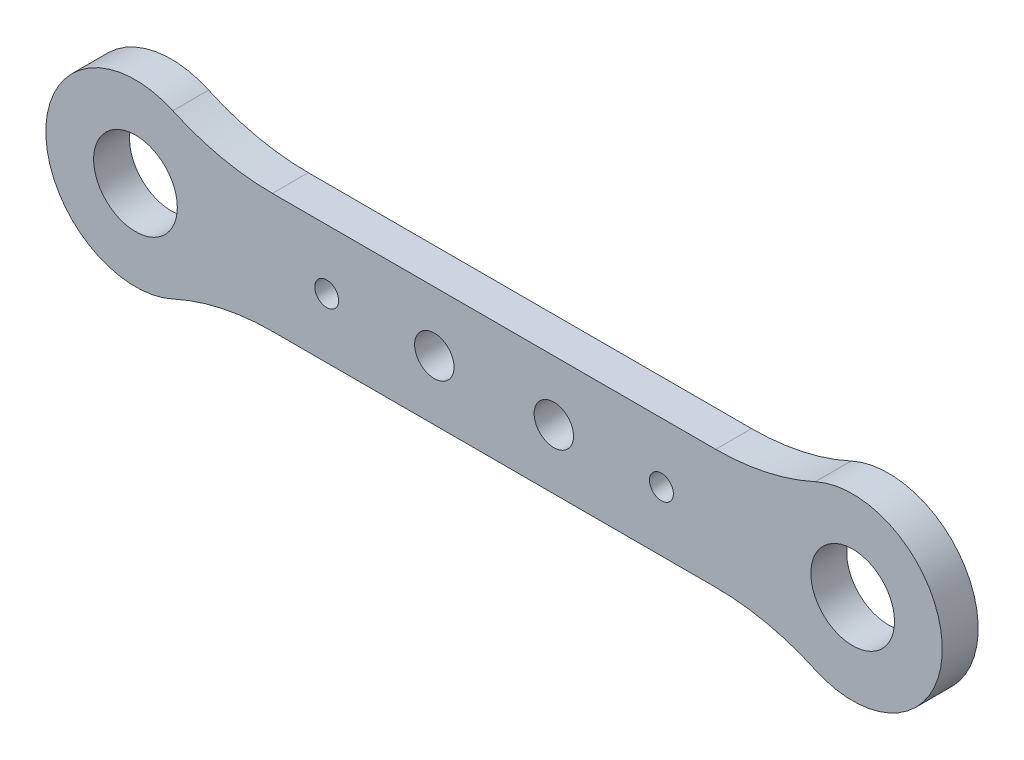
ISO-10303-21;
HEADER;
FILE_DESCRIPTION(('STEP AP214'),'2;1');
FILE_NAME('part.step','',(''),(''),'','','');
FILE_SCHEMA(('AUTOMOTIVE_DESIGN { 1 0 10303 214 1 1 1 1 }'));
ENDSEC;
DATA;
#1=APPLICATION_CONTEXT('core data for automotive mechanical design processes');
#2=APPLICATION_PROTOCOL_DEFINITION('international standard','automotive_design',2000,#1);
#3=PRODUCT_CONTEXT('',#1,'mechanical');
#4=PRODUCT('Part','Part','',(#3));
#5=PRODUCT_RELATED_PRODUCT_CATEGORY('part','',(#4));
#6=PRODUCT_DEFINITION_FORMATION('','',#4);
#7=PRODUCT_DEFINITION_CONTEXT('part definition',#1,'design');
#8=PRODUCT_DEFINITION('design','',#6,#7);
#9=PRODUCT_DEFINITION_SHAPE('','',#8);
#10=(LENGTH_UNIT() NAMED_UNIT(*) SI_UNIT(.MILLI.,.METRE.));
#11=(NAMED_UNIT(*) PLANE_ANGLE_UNIT() SI_UNIT($,.RADIAN.));
#12=(NAMED_UNIT(*) SI_UNIT($,.STERADIAN.) SOLID_ANGLE_UNIT());
#13=UNCERTAINTY_MEASURE_WITH_UNIT(LENGTH_MEASURE(1.E-05),#10,'distance_accuracy_value','');
#14=(GEOMETRIC_REPRESENTATION_CONTEXT(3) GLOBAL_UNCERTAINTY_ASSIGNED_CONTEXT((#13)) GLOBAL_UNIT_ASSIGNED_CONTEXT((#10,
#11,#12)) REPRESENTATION_CONTEXT('',''));
#15=CARTESIAN_POINT('',(0.,0.,0.));
#16=DIRECTION('',(0.,0.,1.));
#17=DIRECTION('',(1.,0.,0.));
#18=AXIS2_PLACEMENT_3D('',#15,#16,#17);
#19=CARTESIAN_POINT('',(60.,0.,3.));
#20=DIRECTION('',(0.,0.,-1.));
#21=DIRECTION('',(-1.,0.,0.));
#22=AXIS2_PLACEMENT_3D('',#19,#20,#21);
#23=CYLINDRICAL_SURFACE('',#22,7.5);
#24=CARTESIAN_POINT('',(60.,0.,3.));
#25=DIRECTION('',(0.,0.,1.));
#26=DIRECTION('',(1.,0.,0.));
#27=AXIS2_PLACEMENT_3D('',#24,#25,#26);
#28=CIRCLE('',#27,7.5);
#29=CARTESIAN_POINT('',(56.875516571621,6.81818181818182,3.));
#30=VERTEX_POINT('',#29);
#31=CARTESIAN_POINT('',(56.875516571621,-6.81818181818181,3.));
#32=VERTEX_POINT('',#31);
#33=EDGE_CURVE('E175',#30,#32,#28,.F.);
#34=ORIENTED_EDGE('',*,*,#33,.T.);
#35=DIRECTION('',(0.,0.,-1.));
#36=VECTOR('',#35,1.);
#37=CARTESIAN_POINT('',(56.875516571621,-6.81818181818181,3.));
#38=LINE('',#37,#36);
#39=CARTESIAN_POINT('',(56.875516571621,-6.81818181818181,0.));
#40=VERTEX_POINT('',#39);
#41=EDGE_CURVE('E147',#32,#40,#38,.T.);
#42=ORIENTED_EDGE('',*,*,#41,.T.);
#43=CARTESIAN_POINT('',(60.,0.,0.));
#44=DIRECTION('',(0.,0.,1.));
#45=DIRECTION('',(1.,0.,0.));
#46=AXIS2_PLACEMENT_3D('',#43,#44,#45);
#47=CIRCLE('',#46,7.5);
#48=CARTESIAN_POINT('',(56.875516571621,6.81818181818182,0.));
#49=VERTEX_POINT('',#48);
#50=EDGE_CURVE('E163',#49,#40,#47,.F.);
#51=ORIENTED_EDGE('',*,*,#50,.F.);
#52=DIRECTION('',(0.,0.,-1.));
#53=VECTOR('',#52,1.);
#54=CARTESIAN_POINT('',(56.875516571621,6.81818181818182,3.));
#55=LINE('',#54,#53);
#56=EDGE_CURVE('E145',#49,#30,#55,.F.);
#57=ORIENTED_EDGE('',*,*,#56,.T.);
#58=EDGE_LOOP('',(#34,#42,#51,#57));
#59=FACE_BOUND('',#58,.T.);
#60=ADVANCED_FACE('F35',(#59),#23,.T.);
#61=CARTESIAN_POINT('',(0.,5.,3.));
#62=DIRECTION('',(0.,1.,0.));
#63=DIRECTION('',(-1.,0.,0.));
#64=AXIS2_PLACEMENT_3D('',#61,#62,#63);
#65=PLANE('',#64);
#66=DIRECTION('',(1.,0.,0.));
#67=VECTOR('',#66,1.);
#68=CARTESIAN_POINT('',(0.,5.,3.));
#69=LINE('',#68,#67);
#70=CARTESIAN_POINT('',(11.4564392373896,5.,3.));
#71=VERTEX_POINT('',#70);
#72=CARTESIAN_POINT('',(48.5435607626104,5.00000000000001,3.));
#73=VERTEX_POINT('',#72);
#74=EDGE_CURVE('E170',#71,#73,#69,.T.);
#75=ORIENTED_EDGE('',*,*,#74,.T.);
#76=DIRECTION('',(0.,0.,1.));
#77=VECTOR('',#76,1.);
#78=CARTESIAN_POINT('',(48.5435607626104,5.00000000000001,0.));
#79=LINE('',#78,#77);
#80=CARTESIAN_POINT('',(48.5435607626104,5.00000000000001,0.));
#81=VERTEX_POINT('',#80);
#82=EDGE_CURVE('E112',#73,#81,#79,.F.);
#83=ORIENTED_EDGE('',*,*,#82,.T.);
#84=DIRECTION('',(1.,0.,0.));
#85=VECTOR('',#84,1.);
#86=CARTESIAN_POINT('',(0.,5.,0.));
#87=LINE('',#86,#85);
#88=CARTESIAN_POINT('',(11.4564392373896,5.,0.));
#89=VERTEX_POINT('',#88);
#90=EDGE_CURVE('E136',#89,#81,#87,.T.);
#91=ORIENTED_EDGE('',*,*,#90,.F.);
#92=DIRECTION('',(0.,0.,-1.));
#93=VECTOR('',#92,1.);
#94=CARTESIAN_POINT('',(11.4564392373896,5.,3.));
#95=LINE('',#94,#93);
#96=EDGE_CURVE('E57',#89,#71,#95,.F.);
#97=ORIENTED_EDGE('',*,*,#96,.T.);
#98=EDGE_LOOP('',(#75,#83,#91,#97));
#99=FACE_BOUND('',#98,.T.);
#100=ADVANCED_FACE('F161',(#99),#65,.T.);
#101=CARTESIAN_POINT('',(0.,0.,3.));
#102=DIRECTION('',(0.,0.,-1.));
#103=DIRECTION('',(-1.,0.,0.));
#104=AXIS2_PLACEMENT_3D('',#101,#102,#103);
#105=CYLINDRICAL_SURFACE('',#104,7.5);
#106=CARTESIAN_POINT('',(0.,0.,0.));
#107=DIRECTION('',(0.,0.,1.));
#108=DIRECTION('',(1.,0.,0.));
#109=AXIS2_PLACEMENT_3D('',#106,#107,#108);
#110=CIRCLE('',#109,7.5);
#111=CARTESIAN_POINT('',(3.12448342837898,6.81818181818182,0.));
#112=VERTEX_POINT('',#111);
#113=CARTESIAN_POINT('',(3.12448342837898,-6.81818181818182,0.));
#114=VERTEX_POINT('',#113);
#115=EDGE_CURVE('E131',#112,#114,#110,.T.);
#116=ORIENTED_EDGE('',*,*,#115,.T.);
#117=DIRECTION('',(0.,0.,-1.));
#118=VECTOR('',#117,1.);
#119=CARTESIAN_POINT('',(3.12448342837898,-6.81818181818182,3.));
#120=LINE('',#119,#118);
#121=CARTESIAN_POINT('',(3.12448342837898,-6.81818181818182,3.));
#122=VERTEX_POINT('',#121);
#123=EDGE_CURVE('E106',#114,#122,#120,.F.);
#124=ORIENTED_EDGE('',*,*,#123,.T.);
#125=CARTESIAN_POINT('',(0.,0.,3.));
#126=DIRECTION('',(0.,0.,1.));
#127=DIRECTION('',(1.,0.,0.));
#128=AXIS2_PLACEMENT_3D('',#125,#126,#127);
#129=CIRCLE('',#128,7.5);
#130=CARTESIAN_POINT('',(3.12448342837898,6.81818181818182,3.));
#131=VERTEX_POINT('',#130);
#132=EDGE_CURVE('E169',#131,#122,#129,.T.);
#133=ORIENTED_EDGE('',*,*,#132,.F.);
#134=DIRECTION('',(0.,0.,-1.));
#135=VECTOR('',#134,1.);
#136=CARTESIAN_POINT('',(3.12448342837898,6.81818181818182,3.));
#137=LINE('',#136,#135);
#138=EDGE_CURVE('E122',#131,#112,#137,.T.);
#139=ORIENTED_EDGE('',*,*,#138,.T.);
#140=EDGE_LOOP('',(#116,#124,#133,#139));
#141=FACE_BOUND('',#140,.T.);
#142=ADVANCED_FACE('F172',(#141),#105,.T.);
#143=CARTESIAN_POINT('',(0.,-5.,3.));
#144=DIRECTION('',(0.,1.,0.));
#145=DIRECTION('',(-1.,0.,0.));
#146=AXIS2_PLACEMENT_3D('',#143,#144,#145);
#147=PLANE('',#146);
#148=DIRECTION('',(1.,0.,0.));
#149=VECTOR('',#148,1.);
#150=CARTESIAN_POINT('',(0.,-5.,3.));
#151=LINE('',#150,#149);
#152=CARTESIAN_POINT('',(11.4564392373896,-5.,3.));
#153=VERTEX_POINT('',#152);
#154=CARTESIAN_POINT('',(48.5435607626104,-4.99999999999999,3.));
#155=VERTEX_POINT('',#154);
#156=EDGE_CURVE('E121',#153,#155,#151,.T.);
#157=ORIENTED_EDGE('',*,*,#156,.F.);
#158=DIRECTION('',(0.,0.,1.));
#159=VECTOR('',#158,1.);
#160=CARTESIAN_POINT('',(11.4564392373896,-5.,0.));
#161=LINE('',#160,#159);
#162=CARTESIAN_POINT('',(11.4564392373896,-5.,0.));
#163=VERTEX_POINT('',#162);
#164=EDGE_CURVE('E105',#153,#163,#161,.F.);
#165=ORIENTED_EDGE('',*,*,#164,.T.);
#166=DIRECTION('',(1.,0.,0.));
#167=VECTOR('',#166,1.);
#168=CARTESIAN_POINT('',(0.,-5.,0.));
#169=LINE('',#168,#167);
#170=CARTESIAN_POINT('',(48.5435607626104,-4.99999999999999,0.));
#171=VERTEX_POINT('',#170);
#172=EDGE_CURVE('E118',#163,#171,#169,.T.);
#173=ORIENTED_EDGE('',*,*,#172,.T.);
#174=DIRECTION('',(0.,0.,-1.));
#175=VECTOR('',#174,1.);
#176=CARTESIAN_POINT('',(48.5435607626104,-4.99999999999999,3.));
#177=LINE('',#176,#175);
#178=EDGE_CURVE('E123',#171,#155,#177,.F.);
#179=ORIENTED_EDGE('',*,*,#178,.T.);
#180=EDGE_LOOP('',(#157,#165,#173,#179));
#181=FACE_BOUND('',#180,.T.);
#182=ADVANCED_FACE('F117',(#181),#147,.F.);
#183=CARTESIAN_POINT('',(0.,0.,3.));
#184=DIRECTION('',(0.,0.,-1.));
#185=DIRECTION('',(-1.,0.,0.));
#186=AXIS2_PLACEMENT_3D('',#183,#184,#185);
#187=CYLINDRICAL_SURFACE('',#186,3.5);
#188=CARTESIAN_POINT('',(0.,0.,3.));
#189=DIRECTION('',(0.,0.,1.));
#190=DIRECTION('',(1.,0.,0.));
#191=AXIS2_PLACEMENT_3D('',#188,#189,#190);
#192=CIRCLE('',#191,3.5);
#193=CARTESIAN_POINT('',(3.5,0.,3.));
#194=VERTEX_POINT('',#193);
#195=EDGE_CURVE('E379',#194,#194,#192,.T.);
#196=ORIENTED_EDGE('',*,*,#195,.T.);
#197=EDGE_LOOP('',(#196));
#198=FACE_BOUND('',#197,.T.);
#199=CARTESIAN_POINT('',(0.,0.,0.));
#200=DIRECTION('',(0.,0.,1.));
#201=DIRECTION('',(1.,0.,0.));
#202=AXIS2_PLACEMENT_3D('',#199,#200,#201);
#203=CIRCLE('',#202,3.5);
#204=CARTESIAN_POINT('',(3.5,0.,0.));
#205=VERTEX_POINT('',#204);
#206=EDGE_CURVE('E193',#205,#205,#203,.T.);
#207=ORIENTED_EDGE('',*,*,#206,.F.);
#208=EDGE_LOOP('',(#207));
#209=FACE_BOUND('',#208,.T.);
#210=ADVANCED_FACE('F219',(#198,#209),#187,.F.);
#211=CARTESIAN_POINT('',(16.,0.,3.));
#212=DIRECTION('',(0.,0.,-1.));
#213=DIRECTION('',(-1.,0.,0.));
#214=AXIS2_PLACEMENT_3D('',#211,#212,#213);
#215=CYLINDRICAL_SURFACE('',#214,0.999999999999998);
#216=CARTESIAN_POINT('',(16.,0.,3.));
#217=DIRECTION('',(0.,0.,1.));
#218=DIRECTION('',(1.,0.,0.));
#219=AXIS2_PLACEMENT_3D('',#216,#217,#218);
#220=CIRCLE('',#219,0.999999999999998);
#221=CARTESIAN_POINT('',(17.,0.,3.));
#222=VERTEX_POINT('',#221);
#223=EDGE_CURVE('E376',#222,#222,#220,.T.);
#224=ORIENTED_EDGE('',*,*,#223,.T.);
#225=EDGE_LOOP('',(#224));
#226=FACE_BOUND('',#225,.T.);
#227=CARTESIAN_POINT('',(16.,0.,0.));
#228=DIRECTION('',(0.,0.,1.));
#229=DIRECTION('',(1.,0.,0.));
#230=AXIS2_PLACEMENT_3D('',#227,#228,#229);
#231=CIRCLE('',#230,0.999999999999998);
#232=CARTESIAN_POINT('',(17.,0.,0.));
#233=VERTEX_POINT('',#232);
#234=EDGE_CURVE('E190',#233,#233,#231,.T.);
#235=ORIENTED_EDGE('',*,*,#234,.F.);
#236=EDGE_LOOP('',(#235));
#237=FACE_BOUND('',#236,.T.);
#238=ADVANCED_FACE('F222',(#226,#237),#215,.F.);
#239=CARTESIAN_POINT('',(44.,0.,3.));
#240=DIRECTION('',(0.,0.,-1.));
#241=DIRECTION('',(-1.,0.,0.));
#242=AXIS2_PLACEMENT_3D('',#239,#240,#241);
#243=CYLINDRICAL_SURFACE('',#242,0.999999999999998);
#244=CARTESIAN_POINT('',(44.,0.,3.));
#245=DIRECTION('',(0.,0.,1.));
#246=DIRECTION('',(1.,0.,0.));
#247=AXIS2_PLACEMENT_3D('',#244,#245,#246);
#248=CIRCLE('',#247,0.999999999999998);
#249=CARTESIAN_POINT('',(45.,0.,3.));
#250=VERTEX_POINT('',#249);
#251=EDGE_CURVE('E372',#250,#250,#248,.F.);
#252=ORIENTED_EDGE('',*,*,#251,.F.);
#253=EDGE_LOOP('',(#252));
#254=FACE_BOUND('',#253,.T.);
#255=CARTESIAN_POINT('',(44.,0.,0.));
#256=DIRECTION('',(0.,0.,1.));
#257=DIRECTION('',(1.,0.,0.));
#258=AXIS2_PLACEMENT_3D('',#255,#256,#257);
#259=CIRCLE('',#258,0.999999999999998);
#260=CARTESIAN_POINT('',(45.,0.,0.));
#261=VERTEX_POINT('',#260);
#262=EDGE_CURVE('E187',#261,#261,#259,.F.);
#263=ORIENTED_EDGE('',*,*,#262,.T.);
#264=EDGE_LOOP('',(#263));
#265=FACE_BOUND('',#264,.T.);
#266=ADVANCED_FACE('F226',(#254,#265),#243,.F.);
#267=CARTESIAN_POINT('',(25.,0.,3.));
#268=DIRECTION('',(0.,0.,-1.));
#269=DIRECTION('',(-1.,0.,0.));
#270=AXIS2_PLACEMENT_3D('',#267,#268,#269);
#271=CYLINDRICAL_SURFACE('',#270,1.65);
#272=CARTESIAN_POINT('',(25.,0.,3.));
#273=DIRECTION('',(0.,0.,1.));
#274=DIRECTION('',(1.,0.,0.));
#275=AXIS2_PLACEMENT_3D('',#272,#273,#274);
#276=CIRCLE('',#275,1.65);
#277=CARTESIAN_POINT('',(26.65,0.,3.));
#278=VERTEX_POINT('',#277);
#279=EDGE_CURVE('E368',#278,#278,#276,.T.);
#280=ORIENTED_EDGE('',*,*,#279,.T.);
#281=EDGE_LOOP('',(#280));
#282=FACE_BOUND('',#281,.T.);
#283=CARTESIAN_POINT('',(25.,0.,0.));
#284=DIRECTION('',(0.,0.,1.));
#285=DIRECTION('',(1.,0.,0.));
#286=AXIS2_PLACEMENT_3D('',#283,#284,#285);
#287=CIRCLE('',#286,1.65);
#288=CARTESIAN_POINT('',(26.65,0.,0.));
#289=VERTEX_POINT('',#288);
#290=EDGE_CURVE('E184',#289,#289,#287,.T.);
#291=ORIENTED_EDGE('',*,*,#290,.F.);
#292=EDGE_LOOP('',(#291));
#293=FACE_BOUND('',#292,.T.);
#294=ADVANCED_FACE('F230',(#282,#293),#271,.F.);
#295=CARTESIAN_POINT('',(35.,0.,3.));
#296=DIRECTION('',(0.,0.,-1.));
#297=DIRECTION('',(-1.,0.,0.));
#298=AXIS2_PLACEMENT_3D('',#295,#296,#297);
#299=CYLINDRICAL_SURFACE('',#298,1.65);
#300=CARTESIAN_POINT('',(35.,0.,3.));
#301=DIRECTION('',(0.,0.,1.));
#302=DIRECTION('',(1.,0.,0.));
#303=AXIS2_PLACEMENT_3D('',#300,#301,#302);
#304=CIRCLE('',#303,1.65);
#305=CARTESIAN_POINT('',(36.65,0.,3.));
#306=VERTEX_POINT('',#305);
#307=EDGE_CURVE('E134',#306,#306,#304,.T.);
#308=ORIENTED_EDGE('',*,*,#307,.T.);
#309=EDGE_LOOP('',(#308));
#310=FACE_BOUND('',#309,.T.);
#311=CARTESIAN_POINT('',(35.,0.,0.));
#312=DIRECTION('',(0.,0.,1.));
#313=DIRECTION('',(1.,0.,0.));
#314=AXIS2_PLACEMENT_3D('',#311,#312,#313);
#315=CIRCLE('',#314,1.65);
#316=CARTESIAN_POINT('',(36.65,0.,0.));
#317=VERTEX_POINT('',#316);
#318=EDGE_CURVE('E181',#317,#317,#315,.T.);
#319=ORIENTED_EDGE('',*,*,#318,.F.);
#320=EDGE_LOOP('',(#319));
#321=FACE_BOUND('',#320,.T.);
#322=ADVANCED_FACE('F234',(#310,#321),#299,.F.);
#323=CARTESIAN_POINT('',(60.,0.,3.));
#324=DIRECTION('',(0.,0.,-1.));
#325=DIRECTION('',(-1.,0.,0.));
#326=AXIS2_PLACEMENT_3D('',#323,#324,#325);
#327=CYLINDRICAL_SURFACE('',#326,3.50000000000001);
#328=CARTESIAN_POINT('',(60.,0.,3.));
#329=DIRECTION('',(0.,0.,1.));
#330=DIRECTION('',(1.,0.,0.));
#331=AXIS2_PLACEMENT_3D('',#328,#329,#330);
#332=CIRCLE('',#331,3.50000000000001);
#333=CARTESIAN_POINT('',(63.5,0.,3.));
#334=VERTEX_POINT('',#333);
#335=EDGE_CURVE('E140',#334,#334,#332,.F.);
#336=ORIENTED_EDGE('',*,*,#335,.F.);
#337=EDGE_LOOP('',(#336));
#338=FACE_BOUND('',#337,.T.);
#339=CARTESIAN_POINT('',(60.,0.,0.));
#340=DIRECTION('',(0.,0.,1.));
#341=DIRECTION('',(1.,0.,0.));
#342=AXIS2_PLACEMENT_3D('',#339,#340,#341);
#343=CIRCLE('',#342,3.50000000000001);
#344=CARTESIAN_POINT('',(63.5,0.,0.));
#345=VERTEX_POINT('',#344);
#346=EDGE_CURVE('E130',#345,#345,#343,.F.);
#347=ORIENTED_EDGE('',*,*,#346,.T.);
#348=EDGE_LOOP('',(#347));
#349=FACE_BOUND('',#348,.T.);
#350=ADVANCED_FACE('F238',(#338,#349),#327,.F.);
#351=CARTESIAN_POINT('',(0.,0.,3.));
#352=DIRECTION('',(0.,0.,1.));
#353=DIRECTION('',(1.,0.,0.));
#354=AXIS2_PLACEMENT_3D('',#351,#352,#353);
#355=PLANE('',#354);
#356=ORIENTED_EDGE('',*,*,#307,.F.);
#357=EDGE_LOOP('',(#356));
#358=FACE_BOUND('',#357,.T.);
#359=ORIENTED_EDGE('',*,*,#279,.F.);
#360=EDGE_LOOP('',(#359));
#361=FACE_BOUND('',#360,.T.);
#362=ORIENTED_EDGE('',*,*,#251,.T.);
#363=EDGE_LOOP('',(#362));
#364=FACE_BOUND('',#363,.T.);
#365=ORIENTED_EDGE('',*,*,#223,.F.);
#366=EDGE_LOOP('',(#365));
#367=FACE_BOUND('',#366,.T.);
#368=ORIENTED_EDGE('',*,*,#195,.F.);
#369=EDGE_LOOP('',(#368));
#370=FACE_BOUND('',#369,.T.);
#371=ORIENTED_EDGE('',*,*,#33,.F.);
#372=CARTESIAN_POINT('',(48.5435607626104,25.,3.));
#373=DIRECTION('',(0.,0.,1.));
#374=DIRECTION('',(1.,0.,0.));
#375=AXIS2_PLACEMENT_3D('',#372,#373,#374);
#376=CIRCLE('',#375,20.);
#377=EDGE_CURVE('E50',#30,#73,#376,.F.);
#378=ORIENTED_EDGE('',*,*,#377,.T.);
#379=ORIENTED_EDGE('',*,*,#74,.F.);
#380=CARTESIAN_POINT('',(11.4564392373896,25.,3.));
#381=DIRECTION('',(0.,0.,1.));
#382=DIRECTION('',(1.,0.,0.));
#383=AXIS2_PLACEMENT_3D('',#380,#381,#382);
#384=CIRCLE('',#383,20.);
#385=EDGE_CURVE('E11',#71,#131,#384,.F.);
#386=ORIENTED_EDGE('',*,*,#385,.T.);
#387=ORIENTED_EDGE('',*,*,#132,.T.);
#388=CARTESIAN_POINT('',(11.4564392373896,-25.,3.));
#389=DIRECTION('',(0.,0.,1.));
#390=DIRECTION('',(1.,0.,0.));
#391=AXIS2_PLACEMENT_3D('',#388,#389,#390);
#392=CIRCLE('',#391,20.);
#393=EDGE_CURVE('E111',#122,#153,#392,.F.);
#394=ORIENTED_EDGE('',*,*,#393,.T.);
#395=ORIENTED_EDGE('',*,*,#156,.T.);
#396=CARTESIAN_POINT('',(48.5435607626104,-25.,3.));
#397=DIRECTION('',(0.,0.,1.));
#398=DIRECTION('',(1.,0.,0.));
#399=AXIS2_PLACEMENT_3D('',#396,#397,#398);
#400=CIRCLE('',#399,20.);
#401=EDGE_CURVE('E155',#155,#32,#400,.F.);
#402=ORIENTED_EDGE('',*,*,#401,.T.);
#403=EDGE_LOOP('',(#371,#378,#379,#386,#387,#394,#395,#402));
#404=FACE_BOUND('',#403,.T.);
#405=ORIENTED_EDGE('',*,*,#335,.T.);
#406=EDGE_LOOP('',(#405));
#407=FACE_BOUND('',#406,.T.);
#408=ADVANCED_FACE('F167',(#358,#361,#364,#367,#370,#404,#407),#355,.T.);
#409=CARTESIAN_POINT('',(0.,0.,0.));
#410=DIRECTION('',(0.,0.,1.));
#411=DIRECTION('',(1.,0.,0.));
#412=AXIS2_PLACEMENT_3D('',#409,#410,#411);
#413=PLANE('',#412);
#414=ORIENTED_EDGE('',*,*,#318,.T.);
#415=EDGE_LOOP('',(#414));
#416=FACE_BOUND('',#415,.T.);
#417=ORIENTED_EDGE('',*,*,#290,.T.);
#418=EDGE_LOOP('',(#417));
#419=FACE_BOUND('',#418,.T.);
#420=ORIENTED_EDGE('',*,*,#262,.F.);
#421=EDGE_LOOP('',(#420));
#422=FACE_BOUND('',#421,.T.);
#423=ORIENTED_EDGE('',*,*,#234,.T.);
#424=EDGE_LOOP('',(#423));
#425=FACE_BOUND('',#424,.T.);
#426=ORIENTED_EDGE('',*,*,#206,.T.);
#427=EDGE_LOOP('',(#426));
#428=FACE_BOUND('',#427,.T.);
#429=ORIENTED_EDGE('',*,*,#90,.T.);
#430=CARTESIAN_POINT('',(48.5435607626104,25.,0.));
#431=DIRECTION('',(0.,0.,1.));
#432=DIRECTION('',(1.,0.,0.));
#433=AXIS2_PLACEMENT_3D('',#430,#431,#432);
#434=CIRCLE('',#433,20.);
#435=EDGE_CURVE('E157',#81,#49,#434,.T.);
#436=ORIENTED_EDGE('',*,*,#435,.T.);
#437=ORIENTED_EDGE('',*,*,#50,.T.);
#438=CARTESIAN_POINT('',(48.5435607626104,-25.,0.));
#439=DIRECTION('',(0.,0.,1.));
#440=DIRECTION('',(1.,0.,0.));
#441=AXIS2_PLACEMENT_3D('',#438,#439,#440);
#442=CIRCLE('',#441,20.);
#443=EDGE_CURVE('E129',#40,#171,#442,.T.);
#444=ORIENTED_EDGE('',*,*,#443,.T.);
#445=ORIENTED_EDGE('',*,*,#172,.F.);
#446=CARTESIAN_POINT('',(11.4564392373896,-25.,0.));
#447=DIRECTION('',(0.,0.,1.));
#448=DIRECTION('',(1.,0.,0.));
#449=AXIS2_PLACEMENT_3D('',#446,#447,#448);
#450=CIRCLE('',#449,20.);
#451=EDGE_CURVE('E101',#163,#114,#450,.T.);
#452=ORIENTED_EDGE('',*,*,#451,.T.);
#453=ORIENTED_EDGE('',*,*,#115,.F.);
#454=CARTESIAN_POINT('',(11.4564392373896,25.,0.));
#455=DIRECTION('',(0.,0.,1.));
#456=DIRECTION('',(1.,0.,0.));
#457=AXIS2_PLACEMENT_3D('',#454,#455,#456);
#458=CIRCLE('',#457,20.);
#459=EDGE_CURVE('E43',#112,#89,#458,.T.);
#460=ORIENTED_EDGE('',*,*,#459,.T.);
#461=EDGE_LOOP('',(#429,#436,#437,#444,#445,#452,#453,#460));
#462=FACE_BOUND('',#461,.T.);
#463=ORIENTED_EDGE('',*,*,#346,.F.);
#464=EDGE_LOOP('',(#463));
#465=FACE_BOUND('',#464,.T.);
#466=ADVANCED_FACE('F126',(#416,#419,#422,#425,#428,#462,#465),#413,.F.);
#467=CARTESIAN_POINT('',(11.4564392373896,-25.,3.));
#468=DIRECTION('',(0.,0.,-1.));
#469=DIRECTION('',(-1.,0.,0.));
#470=AXIS2_PLACEMENT_3D('',#467,#468,#469);
#471=CYLINDRICAL_SURFACE('',#470,20.);
#472=ORIENTED_EDGE('',*,*,#393,.F.);
#473=ORIENTED_EDGE('',*,*,#123,.F.);
#474=ORIENTED_EDGE('',*,*,#451,.F.);
#475=ORIENTED_EDGE('',*,*,#164,.F.);
#476=EDGE_LOOP('',(#472,#473,#474,#475));
#477=FACE_BOUND('',#476,.T.);
#478=ADVANCED_FACE('F104',(#477),#471,.F.);
#479=CARTESIAN_POINT('',(48.5435607626104,-25.,3.));
#480=DIRECTION('',(0.,0.,-1.));
#481=DIRECTION('',(-1.,0.,0.));
#482=AXIS2_PLACEMENT_3D('',#479,#480,#481);
#483=CYLINDRICAL_SURFACE('',#482,20.);
#484=ORIENTED_EDGE('',*,*,#401,.F.);
#485=ORIENTED_EDGE('',*,*,#178,.F.);
#486=ORIENTED_EDGE('',*,*,#443,.F.);
#487=ORIENTED_EDGE('',*,*,#41,.F.);
#488=EDGE_LOOP('',(#484,#485,#486,#487));
#489=FACE_BOUND('',#488,.T.);
#490=ADVANCED_FACE('F204',(#489),#483,.F.);
#491=CARTESIAN_POINT('',(48.5435607626104,25.,3.));
#492=DIRECTION('',(0.,0.,-1.));
#493=DIRECTION('',(-1.,0.,0.));
#494=AXIS2_PLACEMENT_3D('',#491,#492,#493);
#495=CYLINDRICAL_SURFACE('',#494,20.);
#496=ORIENTED_EDGE('',*,*,#377,.F.);
#497=ORIENTED_EDGE('',*,*,#56,.F.);
#498=ORIENTED_EDGE('',*,*,#435,.F.);
#499=ORIENTED_EDGE('',*,*,#82,.F.);
#500=EDGE_LOOP('',(#496,#497,#498,#499));
#501=FACE_BOUND('',#500,.T.);
#502=ADVANCED_FACE('F202',(#501),#495,.F.);
#503=CARTESIAN_POINT('',(11.4564392373896,25.,3.));
#504=DIRECTION('',(0.,0.,-1.));
#505=DIRECTION('',(-1.,0.,0.));
#506=AXIS2_PLACEMENT_3D('',#503,#504,#505);
#507=CYLINDRICAL_SURFACE('',#506,20.);
#508=ORIENTED_EDGE('',*,*,#385,.F.);
#509=ORIENTED_EDGE('',*,*,#96,.F.);
#510=ORIENTED_EDGE('',*,*,#459,.F.);
#511=ORIENTED_EDGE('',*,*,#138,.F.);
#512=EDGE_LOOP('',(#508,#509,#510,#511));
#513=FACE_BOUND('',#512,.T.);
#514=ADVANCED_FACE('F37',(#513),#507,.F.);
#515=CLOSED_SHELL('',(#60,#100,#142,#182,#210,#238,#266,#294,#322,#350,#408,#466,#478,#490,#502,#514));
#516=MANIFOLD_SOLID_BREP('B2',#515);
#517=ADVANCED_BREP_SHAPE_REPRESENTATION('',(#18,#516),#14);
#518=SHAPE_DEFINITION_REPRESENTATION(#9,#517);
ENDSEC;
END-ISO-10303-21;
